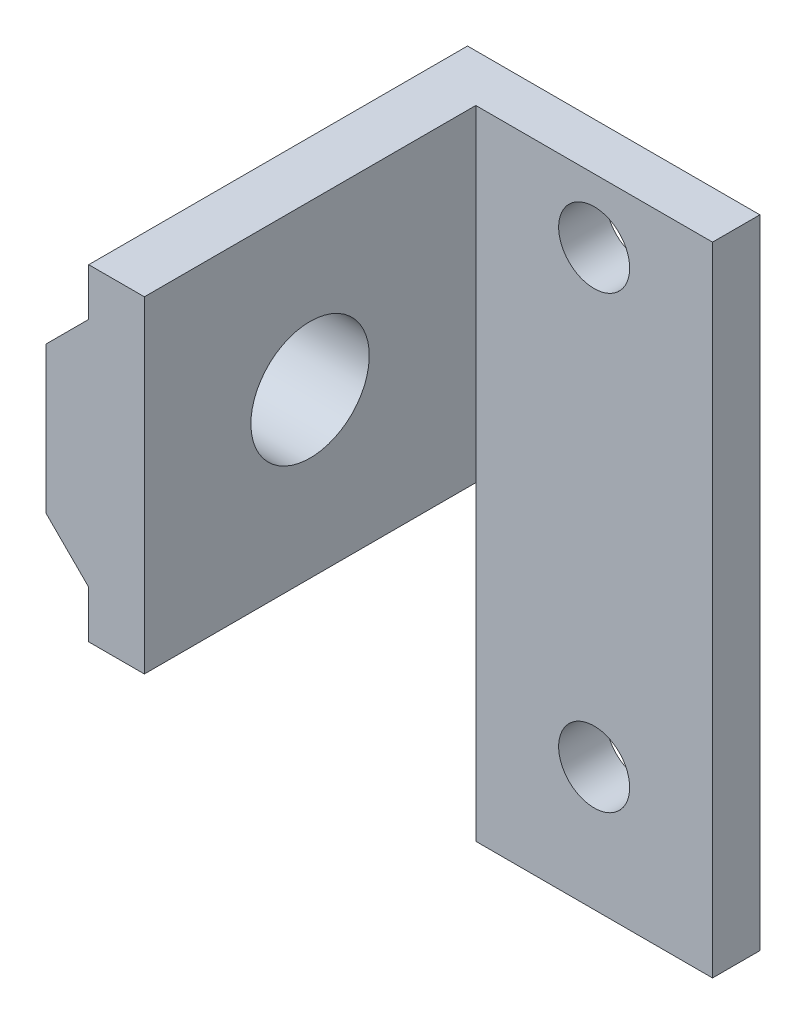
ISO-10303-21;
HEADER;
FILE_DESCRIPTION(('STEP AP214'),'2;1');
FILE_NAME('part.step','',(''),(''),'','','');
FILE_SCHEMA(('AUTOMOTIVE_DESIGN { 1 0 10303 214 1 1 1 1 }'));
ENDSEC;
DATA;
#1=APPLICATION_CONTEXT('core data for automotive mechanical design processes');
#2=APPLICATION_PROTOCOL_DEFINITION('international standard','automotive_design',2000,#1);
#3=PRODUCT_CONTEXT('',#1,'mechanical');
#4=PRODUCT('Part','Part','',(#3));
#5=PRODUCT_RELATED_PRODUCT_CATEGORY('part','',(#4));
#6=PRODUCT_DEFINITION_FORMATION('','',#4);
#7=PRODUCT_DEFINITION_CONTEXT('part definition',#1,'design');
#8=PRODUCT_DEFINITION('design','',#6,#7);
#9=PRODUCT_DEFINITION_SHAPE('','',#8);
#10=(LENGTH_UNIT() NAMED_UNIT(*) SI_UNIT(.MILLI.,.METRE.));
#11=(NAMED_UNIT(*) PLANE_ANGLE_UNIT() SI_UNIT($,.RADIAN.));
#12=(NAMED_UNIT(*) SI_UNIT($,.STERADIAN.) SOLID_ANGLE_UNIT());
#13=UNCERTAINTY_MEASURE_WITH_UNIT(LENGTH_MEASURE(1.E-05),#10,'distance_accuracy_value','');
#14=(GEOMETRIC_REPRESENTATION_CONTEXT(3) GLOBAL_UNCERTAINTY_ASSIGNED_CONTEXT((#13)) GLOBAL_UNIT_ASSIGNED_CONTEXT((#10,
#11,#12)) REPRESENTATION_CONTEXT('',''));
#15=CARTESIAN_POINT('',(0.,0.,0.));
#16=DIRECTION('',(0.,0.,1.));
#17=DIRECTION('',(1.,0.,0.));
#18=AXIS2_PLACEMENT_3D('',#15,#16,#17);
#19=CARTESIAN_POINT('',(0.,0.,2.));
#20=DIRECTION('',(0.,0.,-1.));
#21=DIRECTION('',(-1.,0.,0.));
#22=AXIS2_PLACEMENT_3D('',#19,#20,#21);
#23=PLANE('',#22);
#24=DIRECTION('',(0.,-1.,0.));
#25=VECTOR('',#24,1.);
#26=CARTESIAN_POINT('',(0.,0.,2.));
#27=LINE('',#26,#25);
#28=CARTESIAN_POINT('',(0.,26.92,2.));
#29=VERTEX_POINT('',#28);
#30=CARTESIAN_POINT('',(0.,13.1200000000034,2.));
#31=VERTEX_POINT('',#30);
#32=EDGE_CURVE('E210',#29,#31,#27,.T.);
#33=ORIENTED_EDGE('',*,*,#32,.T.);
#34=CARTESIAN_POINT('',(0.,0.,2.));
#35=VERTEX_POINT('',#34);
#36=EDGE_CURVE('E81',#31,#35,#27,.T.);
#37=ORIENTED_EDGE('',*,*,#36,.T.);
#38=DIRECTION('',(1.,0.,0.));
#39=VECTOR('',#38,1.);
#40=CARTESIAN_POINT('',(0.,0.,2.));
#41=LINE('',#40,#39);
#42=CARTESIAN_POINT('',(10.,0.,2.));
#43=VERTEX_POINT('',#42);
#44=EDGE_CURVE('E212',#35,#43,#41,.T.);
#45=ORIENTED_EDGE('',*,*,#44,.T.);
#46=DIRECTION('',(0.,1.,0.));
#47=VECTOR('',#46,1.);
#48=CARTESIAN_POINT('',(10.,0.,2.));
#49=LINE('',#48,#47);
#50=CARTESIAN_POINT('',(10.,26.92,2.));
#51=VERTEX_POINT('',#50);
#52=EDGE_CURVE('E59',#43,#51,#49,.T.);
#53=ORIENTED_EDGE('',*,*,#52,.T.);
#54=DIRECTION('',(-1.,0.,0.));
#55=VECTOR('',#54,1.);
#56=CARTESIAN_POINT('',(0.,26.92,2.));
#57=LINE('',#56,#55);
#58=EDGE_CURVE('E215',#51,#29,#57,.T.);
#59=ORIENTED_EDGE('',*,*,#58,.T.);
#60=EDGE_LOOP('',(#33,#37,#45,#53,#59));
#61=FACE_BOUND('',#60,.T.);
#62=CARTESIAN_POINT('',(5.,24.22,2.));
#63=DIRECTION('',(0.,0.,1.));
#64=DIRECTION('',(1.,0.,0.));
#65=AXIS2_PLACEMENT_3D('',#62,#63,#64);
#66=CIRCLE('',#65,1.5);
#67=CARTESIAN_POINT('',(6.5,24.22,2.));
#68=VERTEX_POINT('',#67);
#69=EDGE_CURVE('E204',#68,#68,#66,.T.);
#70=ORIENTED_EDGE('',*,*,#69,.F.);
#71=EDGE_LOOP('',(#70));
#72=FACE_BOUND('',#71,.T.);
#73=CARTESIAN_POINT('',(5.,5.22,2.));
#74=DIRECTION('',(0.,0.,1.));
#75=DIRECTION('',(1.,0.,0.));
#76=AXIS2_PLACEMENT_3D('',#73,#74,#75);
#77=CIRCLE('',#76,1.5);
#78=CARTESIAN_POINT('',(6.5,5.22,2.));
#79=VERTEX_POINT('',#78);
#80=EDGE_CURVE('E198',#79,#79,#77,.T.);
#81=ORIENTED_EDGE('',*,*,#80,.F.);
#82=EDGE_LOOP('',(#81));
#83=FACE_BOUND('',#82,.T.);
#84=ADVANCED_FACE('F33',(#61,#72,#83),#23,.F.);
#85=CARTESIAN_POINT('',(0.,0.,0.));
#86=DIRECTION('',(0.,0.,-1.));
#87=DIRECTION('',(-1.,0.,0.));
#88=AXIS2_PLACEMENT_3D('',#85,#86,#87);
#89=PLANE('',#88);
#90=CARTESIAN_POINT('',(5.,24.22,0.));
#91=DIRECTION('',(0.,0.,1.));
#92=DIRECTION('',(1.,0.,0.));
#93=AXIS2_PLACEMENT_3D('',#90,#91,#92);
#94=CIRCLE('',#93,1.5);
#95=CARTESIAN_POINT('',(6.5,24.22,0.));
#96=VERTEX_POINT('',#95);
#97=EDGE_CURVE('E201',#96,#96,#94,.T.);
#98=ORIENTED_EDGE('',*,*,#97,.T.);
#99=EDGE_LOOP('',(#98));
#100=FACE_BOUND('',#99,.T.);
#101=DIRECTION('',(0.,-1.,0.));
#102=VECTOR('',#101,1.);
#103=CARTESIAN_POINT('',(0.,0.,0.));
#104=LINE('',#103,#102);
#105=CARTESIAN_POINT('',(0.,13.1200000000034,0.));
#106=VERTEX_POINT('',#105);
#107=CARTESIAN_POINT('',(0.,0.,0.));
#108=VERTEX_POINT('',#107);
#109=EDGE_CURVE('E207',#106,#108,#104,.T.);
#110=ORIENTED_EDGE('',*,*,#109,.F.);
#111=DIRECTION('',(-1.,0.,0.));
#112=VECTOR('',#111,1.);
#113=CARTESIAN_POINT('',(0.,13.1200000000034,0.));
#114=LINE('',#113,#112);
#115=CARTESIAN_POINT('',(-2.35,13.1200000000034,0.));
#116=VERTEX_POINT('',#115);
#117=EDGE_CURVE('E51',#106,#116,#114,.T.);
#118=ORIENTED_EDGE('',*,*,#117,.T.);
#119=DIRECTION('',(0.,1.,0.));
#120=VECTOR('',#119,1.);
#121=CARTESIAN_POINT('',(-2.35,15.1200000000034,0.));
#122=LINE('',#121,#120);
#123=CARTESIAN_POINT('',(-2.35,15.1200000000034,0.));
#124=VERTEX_POINT('',#123);
#125=EDGE_CURVE('E170',#116,#124,#122,.T.);
#126=ORIENTED_EDGE('',*,*,#125,.T.);
#127=DIRECTION('',(-0.707106781186547,0.707106781186548,0.));
#128=VECTOR('',#127,1.);
#129=CARTESIAN_POINT('',(-4.15000000000135,16.9200000000048,0.));
#130=LINE('',#129,#128);
#131=CARTESIAN_POINT('',(-4.15000000000135,16.9200000000048,0.));
#132=VERTEX_POINT('',#131);
#133=EDGE_CURVE('E173',#124,#132,#130,.T.);
#134=ORIENTED_EDGE('',*,*,#133,.T.);
#135=DIRECTION('',(0.,1.,0.));
#136=VECTOR('',#135,1.);
#137=CARTESIAN_POINT('',(-4.15000000000135,23.1199999999987,0.));
#138=LINE('',#137,#136);
#139=CARTESIAN_POINT('',(-4.15000000000135,23.1199999999987,0.));
#140=VERTEX_POINT('',#139);
#141=EDGE_CURVE('E176',#132,#140,#138,.T.);
#142=ORIENTED_EDGE('',*,*,#141,.T.);
#143=DIRECTION('',(0.707106781186548,0.707106781186547,0.));
#144=VECTOR('',#143,1.);
#145=CARTESIAN_POINT('',(-2.35,24.92,0.));
#146=LINE('',#145,#144);
#147=CARTESIAN_POINT('',(-2.35,24.92,0.));
#148=VERTEX_POINT('',#147);
#149=EDGE_CURVE('E179',#140,#148,#146,.T.);
#150=ORIENTED_EDGE('',*,*,#149,.T.);
#151=DIRECTION('',(0.,1.,0.));
#152=VECTOR('',#151,1.);
#153=CARTESIAN_POINT('',(-2.35,24.92,0.));
#154=LINE('',#153,#152);
#155=CARTESIAN_POINT('',(-2.35,26.92,0.));
#156=VERTEX_POINT('',#155);
#157=EDGE_CURVE('E141',#148,#156,#154,.T.);
#158=ORIENTED_EDGE('',*,*,#157,.T.);
#159=DIRECTION('',(-1.,0.,0.));
#160=VECTOR('',#159,1.);
#161=CARTESIAN_POINT('',(0.,26.92,0.));
#162=LINE('',#161,#160);
#163=CARTESIAN_POINT('',(10.,26.92,0.));
#164=VERTEX_POINT('',#163);
#165=EDGE_CURVE('E222',#164,#156,#162,.T.);
#166=ORIENTED_EDGE('',*,*,#165,.F.);
#167=DIRECTION('',(0.,1.,0.));
#168=VECTOR('',#167,1.);
#169=CARTESIAN_POINT('',(10.,0.,0.));
#170=LINE('',#169,#168);
#171=CARTESIAN_POINT('',(10.,0.,0.));
#172=VERTEX_POINT('',#171);
#173=EDGE_CURVE('E76',#172,#164,#170,.T.);
#174=ORIENTED_EDGE('',*,*,#173,.F.);
#175=DIRECTION('',(1.,0.,0.));
#176=VECTOR('',#175,1.);
#177=CARTESIAN_POINT('',(0.,0.,0.));
#178=LINE('',#177,#176);
#179=EDGE_CURVE('E219',#108,#172,#178,.T.);
#180=ORIENTED_EDGE('',*,*,#179,.F.);
#181=EDGE_LOOP('',(#110,#118,#126,#134,#142,#150,#158,#166,#174,#180));
#182=FACE_BOUND('',#181,.T.);
#183=CARTESIAN_POINT('',(5.,5.22,0.));
#184=DIRECTION('',(0.,0.,1.));
#185=DIRECTION('',(1.,0.,0.));
#186=AXIS2_PLACEMENT_3D('',#183,#184,#185);
#187=CIRCLE('',#186,1.5);
#188=CARTESIAN_POINT('',(6.5,5.22,0.));
#189=VERTEX_POINT('',#188);
#190=EDGE_CURVE('E185',#189,#189,#187,.T.);
#191=ORIENTED_EDGE('',*,*,#190,.T.);
#192=EDGE_LOOP('',(#191));
#193=FACE_BOUND('',#192,.T.);
#194=ADVANCED_FACE('F235',(#100,#182,#193),#89,.T.);
#195=CARTESIAN_POINT('',(0.,0.,2.));
#196=DIRECTION('',(1.,0.,0.));
#197=DIRECTION('',(0.,0.,-1.));
#198=AXIS2_PLACEMENT_3D('',#195,#196,#197);
#199=PLANE('',#198);
#200=ORIENTED_EDGE('',*,*,#36,.F.);
#201=DIRECTION('',(0.,0.,-1.));
#202=VECTOR('',#201,1.);
#203=CARTESIAN_POINT('',(0.,13.1200000000034,16.));
#204=LINE('',#203,#202);
#205=EDGE_CURVE('E11',#31,#106,#204,.T.);
#206=ORIENTED_EDGE('',*,*,#205,.T.);
#207=ORIENTED_EDGE('',*,*,#109,.T.);
#208=DIRECTION('',(0.,0.,-1.));
#209=VECTOR('',#208,1.);
#210=CARTESIAN_POINT('',(0.,0.,2.));
#211=LINE('',#210,#209);
#212=EDGE_CURVE('E42',#35,#108,#211,.T.);
#213=ORIENTED_EDGE('',*,*,#212,.F.);
#214=EDGE_LOOP('',(#200,#206,#207,#213));
#215=FACE_BOUND('',#214,.T.);
#216=ADVANCED_FACE('F35',(#215),#199,.F.);
#217=CARTESIAN_POINT('',(0.,0.,2.));
#218=DIRECTION('',(0.,1.,0.));
#219=DIRECTION('',(0.,0.,1.));
#220=AXIS2_PLACEMENT_3D('',#217,#218,#219);
#221=PLANE('',#220);
#222=ORIENTED_EDGE('',*,*,#179,.T.);
#223=DIRECTION('',(0.,0.,-1.));
#224=VECTOR('',#223,1.);
#225=CARTESIAN_POINT('',(10.,0.,2.));
#226=LINE('',#225,#224);
#227=EDGE_CURVE('E225',#43,#172,#226,.T.);
#228=ORIENTED_EDGE('',*,*,#227,.F.);
#229=ORIENTED_EDGE('',*,*,#44,.F.);
#230=ORIENTED_EDGE('',*,*,#212,.T.);
#231=EDGE_LOOP('',(#222,#228,#229,#230));
#232=FACE_BOUND('',#231,.T.);
#233=ADVANCED_FACE('F229',(#232),#221,.F.);
#234=CARTESIAN_POINT('',(10.,0.,2.));
#235=DIRECTION('',(-1.,0.,0.));
#236=DIRECTION('',(0.,0.,1.));
#237=AXIS2_PLACEMENT_3D('',#234,#235,#236);
#238=PLANE('',#237);
#239=ORIENTED_EDGE('',*,*,#173,.T.);
#240=DIRECTION('',(0.,0.,-1.));
#241=VECTOR('',#240,1.);
#242=CARTESIAN_POINT('',(10.,26.92,2.));
#243=LINE('',#242,#241);
#244=EDGE_CURVE('E217',#51,#164,#243,.T.);
#245=ORIENTED_EDGE('',*,*,#244,.F.);
#246=ORIENTED_EDGE('',*,*,#52,.F.);
#247=ORIENTED_EDGE('',*,*,#227,.T.);
#248=EDGE_LOOP('',(#239,#245,#246,#247));
#249=FACE_BOUND('',#248,.T.);
#250=ADVANCED_FACE('F269',(#249),#238,.F.);
#251=CARTESIAN_POINT('',(0.,26.92,2.));
#252=DIRECTION('',(0.,-1.,0.));
#253=DIRECTION('',(0.,0.,-1.));
#254=AXIS2_PLACEMENT_3D('',#251,#252,#253);
#255=PLANE('',#254);
#256=ORIENTED_EDGE('',*,*,#165,.T.);
#257=DIRECTION('',(0.,0.,-1.));
#258=VECTOR('',#257,1.);
#259=CARTESIAN_POINT('',(-2.35,26.92,16.));
#260=LINE('',#259,#258);
#261=CARTESIAN_POINT('',(-2.35,26.92,16.));
#262=VERTEX_POINT('',#261);
#263=EDGE_CURVE('E186',#262,#156,#260,.T.);
#264=ORIENTED_EDGE('',*,*,#263,.F.);
#265=DIRECTION('',(1.,0.,0.));
#266=VECTOR('',#265,1.);
#267=CARTESIAN_POINT('',(-2.35,26.92,16.));
#268=LINE('',#267,#266);
#269=CARTESIAN_POINT('',(0.,26.92,16.));
#270=VERTEX_POINT('',#269);
#271=EDGE_CURVE('E146',#262,#270,#268,.T.);
#272=ORIENTED_EDGE('',*,*,#271,.T.);
#273=DIRECTION('',(0.,0.,-1.));
#274=VECTOR('',#273,1.);
#275=CARTESIAN_POINT('',(0.,26.92,16.));
#276=LINE('',#275,#274);
#277=EDGE_CURVE('E135',#270,#29,#276,.T.);
#278=ORIENTED_EDGE('',*,*,#277,.T.);
#279=ORIENTED_EDGE('',*,*,#58,.F.);
#280=ORIENTED_EDGE('',*,*,#244,.T.);
#281=EDGE_LOOP('',(#256,#264,#272,#278,#279,#280));
#282=FACE_BOUND('',#281,.T.);
#283=ADVANCED_FACE('F240',(#282),#255,.F.);
#284=CARTESIAN_POINT('',(5.,24.22,2.));
#285=DIRECTION('',(0.,0.,-1.));
#286=DIRECTION('',(-1.,0.,0.));
#287=AXIS2_PLACEMENT_3D('',#284,#285,#286);
#288=CYLINDRICAL_SURFACE('',#287,1.5);
#289=ORIENTED_EDGE('',*,*,#69,.T.);
#290=EDGE_LOOP('',(#289));
#291=FACE_BOUND('',#290,.T.);
#292=ORIENTED_EDGE('',*,*,#97,.F.);
#293=EDGE_LOOP('',(#292));
#294=FACE_BOUND('',#293,.T.);
#295=ADVANCED_FACE('F256',(#291,#294),#288,.F.);
#296=CARTESIAN_POINT('',(5.,5.22,2.));
#297=DIRECTION('',(0.,0.,-1.));
#298=DIRECTION('',(-1.,0.,0.));
#299=AXIS2_PLACEMENT_3D('',#296,#297,#298);
#300=CYLINDRICAL_SURFACE('',#299,1.5);
#301=ORIENTED_EDGE('',*,*,#80,.T.);
#302=EDGE_LOOP('',(#301));
#303=FACE_BOUND('',#302,.T.);
#304=ORIENTED_EDGE('',*,*,#190,.F.);
#305=EDGE_LOOP('',(#304));
#306=FACE_BOUND('',#305,.T.);
#307=ADVANCED_FACE('F253',(#303,#306),#300,.F.);
#308=CARTESIAN_POINT('',(0.,15.1200000000034,16.));
#309=DIRECTION('',(1.,0.,0.));
#310=DIRECTION('',(0.,1.,0.));
#311=AXIS2_PLACEMENT_3D('',#308,#309,#310);
#312=PLANE('',#311);
#313=CARTESIAN_POINT('',(0.,20.0200000000017,9.));
#314=DIRECTION('',(1.,0.,0.));
#315=DIRECTION('',(0.,1.,0.));
#316=AXIS2_PLACEMENT_3D('',#313,#314,#315);
#317=CIRCLE('',#316,2.5);
#318=CARTESIAN_POINT('',(0.,22.5200000000017,9.));
#319=VERTEX_POINT('',#318);
#320=EDGE_CURVE('E402',#319,#319,#317,.T.);
#321=ORIENTED_EDGE('',*,*,#320,.F.);
#322=EDGE_LOOP('',(#321));
#323=FACE_BOUND('',#322,.T.);
#324=ORIENTED_EDGE('',*,*,#32,.F.);
#325=ORIENTED_EDGE('',*,*,#277,.F.);
#326=DIRECTION('',(0.,-1.,0.));
#327=VECTOR('',#326,1.);
#328=CARTESIAN_POINT('',(0.,24.92,16.));
#329=LINE('',#328,#327);
#330=CARTESIAN_POINT('',(0.,13.1200000000034,16.));
#331=VERTEX_POINT('',#330);
#332=EDGE_CURVE('E131',#270,#331,#329,.T.);
#333=ORIENTED_EDGE('',*,*,#332,.T.);
#334=EDGE_CURVE('E44',#331,#31,#204,.T.);
#335=ORIENTED_EDGE('',*,*,#334,.T.);
#336=EDGE_LOOP('',(#324,#325,#333,#335));
#337=FACE_BOUND('',#336,.T.);
#338=ADVANCED_FACE('F133',(#323,#337),#312,.T.);
#339=CARTESIAN_POINT('',(-2.35,24.92,16.));
#340=DIRECTION('',(-1.,0.,0.));
#341=DIRECTION('',(0.,0.,1.));
#342=AXIS2_PLACEMENT_3D('',#339,#340,#341);
#343=PLANE('',#342);
#344=ORIENTED_EDGE('',*,*,#157,.F.);
#345=DIRECTION('',(0.,0.,-1.));
#346=VECTOR('',#345,1.);
#347=CARTESIAN_POINT('',(-2.35,24.92,16.));
#348=LINE('',#347,#346);
#349=CARTESIAN_POINT('',(-2.35,24.92,16.));
#350=VERTEX_POINT('',#349);
#351=EDGE_CURVE('E189',#350,#148,#348,.T.);
#352=ORIENTED_EDGE('',*,*,#351,.F.);
#353=DIRECTION('',(0.,1.,0.));
#354=VECTOR('',#353,1.);
#355=CARTESIAN_POINT('',(-2.35,24.92,16.));
#356=LINE('',#355,#354);
#357=EDGE_CURVE('E165',#350,#262,#356,.T.);
#358=ORIENTED_EDGE('',*,*,#357,.T.);
#359=ORIENTED_EDGE('',*,*,#263,.T.);
#360=EDGE_LOOP('',(#344,#352,#358,#359));
#361=FACE_BOUND('',#360,.T.);
#362=ADVANCED_FACE('F243',(#361),#343,.T.);
#363=CARTESIAN_POINT('',(-2.35,24.92,16.));
#364=DIRECTION('',(-0.707106781186547,0.707106781186548,0.));
#365=DIRECTION('',(-0.707106781186548,-0.707106781186547,0.));
#366=AXIS2_PLACEMENT_3D('',#363,#364,#365);
#367=PLANE('',#366);
#368=ORIENTED_EDGE('',*,*,#149,.F.);
#369=DIRECTION('',(0.,0.,-1.));
#370=VECTOR('',#369,1.);
#371=CARTESIAN_POINT('',(-4.15000000000135,23.1199999999987,16.));
#372=LINE('',#371,#370);
#373=CARTESIAN_POINT('',(-4.15000000000135,23.1199999999987,16.));
#374=VERTEX_POINT('',#373);
#375=EDGE_CURVE('E191',#374,#140,#372,.T.);
#376=ORIENTED_EDGE('',*,*,#375,.F.);
#377=DIRECTION('',(0.707106781186548,0.707106781186547,0.));
#378=VECTOR('',#377,1.);
#379=CARTESIAN_POINT('',(-2.35,24.92,16.));
#380=LINE('',#379,#378);
#381=EDGE_CURVE('E162',#374,#350,#380,.T.);
#382=ORIENTED_EDGE('',*,*,#381,.T.);
#383=ORIENTED_EDGE('',*,*,#351,.T.);
#384=EDGE_LOOP('',(#368,#376,#382,#383));
#385=FACE_BOUND('',#384,.T.);
#386=ADVANCED_FACE('F319',(#385),#367,.T.);
#387=CARTESIAN_POINT('',(-4.15000000000135,23.1199999999987,16.));
#388=DIRECTION('',(-1.,0.,0.));
#389=DIRECTION('',(0.,-1.,0.));
#390=AXIS2_PLACEMENT_3D('',#387,#388,#389);
#391=PLANE('',#390);
#392=CARTESIAN_POINT('',(-4.15000000000135,20.0200000000017,9.));
#393=DIRECTION('',(-1.,0.,0.));
#394=DIRECTION('',(0.,-1.,0.));
#395=AXIS2_PLACEMENT_3D('',#392,#393,#394);
#396=CIRCLE('',#395,2.5);
#397=CARTESIAN_POINT('',(-4.15000000000135,17.5200000000017,9.));
#398=VERTEX_POINT('',#397);
#399=EDGE_CURVE('E37',#398,#398,#396,.T.);
#400=ORIENTED_EDGE('',*,*,#399,.F.);
#401=EDGE_LOOP('',(#400));
#402=FACE_BOUND('',#401,.T.);
#403=ORIENTED_EDGE('',*,*,#141,.F.);
#404=DIRECTION('',(0.,0.,-1.));
#405=VECTOR('',#404,1.);
#406=CARTESIAN_POINT('',(-4.15000000000135,16.9200000000048,16.));
#407=LINE('',#406,#405);
#408=CARTESIAN_POINT('',(-4.15000000000135,16.9200000000048,16.));
#409=VERTEX_POINT('',#408);
#410=EDGE_CURVE('E193',#409,#132,#407,.T.);
#411=ORIENTED_EDGE('',*,*,#410,.F.);
#412=DIRECTION('',(0.,1.,0.));
#413=VECTOR('',#412,1.);
#414=CARTESIAN_POINT('',(-4.15000000000135,23.1199999999987,16.));
#415=LINE('',#414,#413);
#416=EDGE_CURVE('E159',#409,#374,#415,.T.);
#417=ORIENTED_EDGE('',*,*,#416,.T.);
#418=ORIENTED_EDGE('',*,*,#375,.T.);
#419=EDGE_LOOP('',(#403,#411,#417,#418));
#420=FACE_BOUND('',#419,.T.);
#421=ADVANCED_FACE('F329',(#402,#420),#391,.T.);
#422=CARTESIAN_POINT('',(-4.15000000000135,16.9200000000048,16.));
#423=DIRECTION('',(-0.707106781186548,-0.707106781186547,0.));
#424=DIRECTION('',(0.707106781186547,-0.707106781186548,0.));
#425=AXIS2_PLACEMENT_3D('',#422,#423,#424);
#426=PLANE('',#425);
#427=ORIENTED_EDGE('',*,*,#133,.F.);
#428=DIRECTION('',(0.,0.,-1.));
#429=VECTOR('',#428,1.);
#430=CARTESIAN_POINT('',(-2.35,15.1200000000034,16.));
#431=LINE('',#430,#429);
#432=CARTESIAN_POINT('',(-2.35,15.1200000000034,16.));
#433=VERTEX_POINT('',#432);
#434=EDGE_CURVE('E195',#433,#124,#431,.T.);
#435=ORIENTED_EDGE('',*,*,#434,.F.);
#436=DIRECTION('',(-0.707106781186547,0.707106781186548,0.));
#437=VECTOR('',#436,1.);
#438=CARTESIAN_POINT('',(-4.15000000000135,16.9200000000048,16.));
#439=LINE('',#438,#437);
#440=EDGE_CURVE('E153',#433,#409,#439,.T.);
#441=ORIENTED_EDGE('',*,*,#440,.T.);
#442=ORIENTED_EDGE('',*,*,#410,.T.);
#443=EDGE_LOOP('',(#427,#435,#441,#442));
#444=FACE_BOUND('',#443,.T.);
#445=ADVANCED_FACE('F337',(#444),#426,.T.);
#446=CARTESIAN_POINT('',(-2.35,15.1200000000034,16.));
#447=DIRECTION('',(-1.,0.,0.));
#448=DIRECTION('',(0.,-1.,0.));
#449=AXIS2_PLACEMENT_3D('',#446,#447,#448);
#450=PLANE('',#449);
#451=ORIENTED_EDGE('',*,*,#125,.F.);
#452=DIRECTION('',(0.,0.,-1.));
#453=VECTOR('',#452,1.);
#454=CARTESIAN_POINT('',(-2.35,13.1200000000034,16.));
#455=LINE('',#454,#453);
#456=CARTESIAN_POINT('',(-2.35,13.1200000000034,16.));
#457=VERTEX_POINT('',#456);
#458=EDGE_CURVE('E145',#457,#116,#455,.T.);
#459=ORIENTED_EDGE('',*,*,#458,.F.);
#460=DIRECTION('',(0.,1.,0.));
#461=VECTOR('',#460,1.);
#462=CARTESIAN_POINT('',(-2.35,15.1200000000034,16.));
#463=LINE('',#462,#461);
#464=EDGE_CURVE('E151',#457,#433,#463,.T.);
#465=ORIENTED_EDGE('',*,*,#464,.T.);
#466=ORIENTED_EDGE('',*,*,#434,.T.);
#467=EDGE_LOOP('',(#451,#459,#465,#466));
#468=FACE_BOUND('',#467,.T.);
#469=ADVANCED_FACE('F342',(#468),#450,.T.);
#470=CARTESIAN_POINT('',(0.,13.1200000000034,16.));
#471=DIRECTION('',(0.,-1.,0.));
#472=DIRECTION('',(0.,0.,-1.));
#473=AXIS2_PLACEMENT_3D('',#470,#471,#472);
#474=PLANE('',#473);
#475=ORIENTED_EDGE('',*,*,#117,.F.);
#476=ORIENTED_EDGE('',*,*,#205,.F.);
#477=ORIENTED_EDGE('',*,*,#334,.F.);
#478=DIRECTION('',(-1.,0.,0.));
#479=VECTOR('',#478,1.);
#480=CARTESIAN_POINT('',(0.,13.1200000000034,16.));
#481=LINE('',#480,#479);
#482=EDGE_CURVE('E140',#331,#457,#481,.T.);
#483=ORIENTED_EDGE('',*,*,#482,.T.);
#484=ORIENTED_EDGE('',*,*,#458,.T.);
#485=EDGE_LOOP('',(#475,#476,#477,#483,#484));
#486=FACE_BOUND('',#485,.T.);
#487=ADVANCED_FACE('F144',(#486),#474,.T.);
#488=CARTESIAN_POINT('',(0.,0.,16.));
#489=DIRECTION('',(0.,0.,-1.));
#490=DIRECTION('',(-1.,0.,0.));
#491=AXIS2_PLACEMENT_3D('',#488,#489,#490);
#492=PLANE('',#491);
#493=ORIENTED_EDGE('',*,*,#332,.F.);
#494=ORIENTED_EDGE('',*,*,#271,.F.);
#495=ORIENTED_EDGE('',*,*,#357,.F.);
#496=ORIENTED_EDGE('',*,*,#381,.F.);
#497=ORIENTED_EDGE('',*,*,#416,.F.);
#498=ORIENTED_EDGE('',*,*,#440,.F.);
#499=ORIENTED_EDGE('',*,*,#464,.F.);
#500=ORIENTED_EDGE('',*,*,#482,.F.);
#501=EDGE_LOOP('',(#493,#494,#495,#496,#497,#498,#499,#500));
#502=FACE_BOUND('',#501,.T.);
#503=ADVANCED_FACE('F148',(#502),#492,.F.);
#504=CARTESIAN_POINT('',(-16.,20.0200000000017,9.));
#505=DIRECTION('',(1.,0.,0.));
#506=DIRECTION('',(0.,1.,0.));
#507=AXIS2_PLACEMENT_3D('',#504,#505,#506);
#508=CYLINDRICAL_SURFACE('',#507,2.5);
#509=ORIENTED_EDGE('',*,*,#399,.T.);
#510=EDGE_LOOP('',(#509));
#511=FACE_BOUND('',#510,.T.);
#512=ORIENTED_EDGE('',*,*,#320,.T.);
#513=EDGE_LOOP('',(#512));
#514=FACE_BOUND('',#513,.T.);
#515=ADVANCED_FACE('F369',(#511,#514),#508,.F.);
#516=CLOSED_SHELL('',(#84,#194,#216,#233,#250,#283,#295,#307,#338,#362,#386,#421,#445,#469,#487,
#503,#515));
#517=MANIFOLD_SOLID_BREP('B2',#516);
#518=ADVANCED_BREP_SHAPE_REPRESENTATION('',(#18,#517),#14);
#519=SHAPE_DEFINITION_REPRESENTATION(#9,#518);
ENDSEC;
END-ISO-10303-21;
